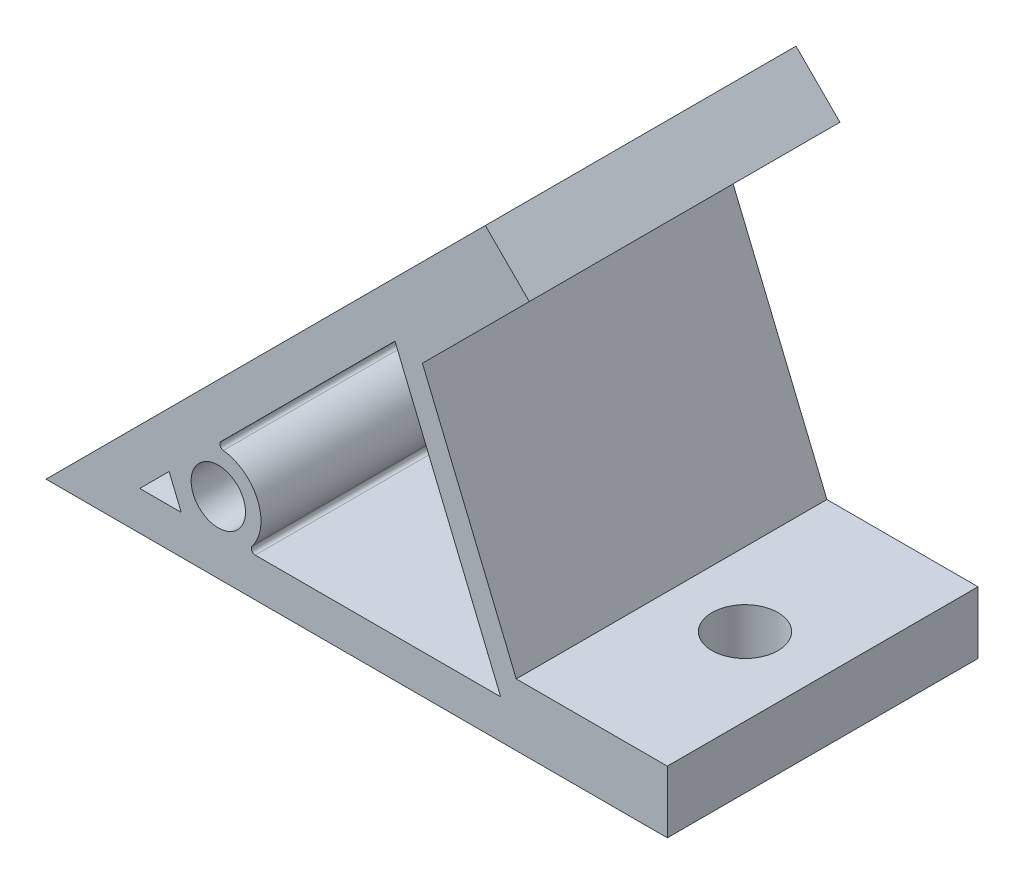
ISO-10303-21;
HEADER;
FILE_DESCRIPTION(('STEP AP214'),'2;1');
FILE_NAME('part.step','',(''),(''),'','','');
FILE_SCHEMA(('AUTOMOTIVE_DESIGN { 1 0 10303 214 1 1 1 1 }'));
ENDSEC;
DATA;
#1=APPLICATION_CONTEXT('core data for automotive mechanical design processes');
#2=APPLICATION_PROTOCOL_DEFINITION('international standard','automotive_design',2000,#1);
#3=PRODUCT_CONTEXT('',#1,'mechanical');
#4=PRODUCT('Part','Part','',(#3));
#5=PRODUCT_RELATED_PRODUCT_CATEGORY('part','',(#4));
#6=PRODUCT_DEFINITION_FORMATION('','',#4);
#7=PRODUCT_DEFINITION_CONTEXT('part definition',#1,'design');
#8=PRODUCT_DEFINITION('design','',#6,#7);
#9=PRODUCT_DEFINITION_SHAPE('','',#8);
#10=(LENGTH_UNIT() NAMED_UNIT(*) SI_UNIT(.MILLI.,.METRE.));
#11=(NAMED_UNIT(*) PLANE_ANGLE_UNIT() SI_UNIT($,.RADIAN.));
#12=(NAMED_UNIT(*) SI_UNIT($,.STERADIAN.) SOLID_ANGLE_UNIT());
#13=UNCERTAINTY_MEASURE_WITH_UNIT(LENGTH_MEASURE(1.E-05),#10,'distance_accuracy_value','');
#14=(GEOMETRIC_REPRESENTATION_CONTEXT(3) GLOBAL_UNCERTAINTY_ASSIGNED_CONTEXT((#13)) GLOBAL_UNIT_ASSIGNED_CONTEXT((#10,
#11,#12)) REPRESENTATION_CONTEXT('',''));
#15=CARTESIAN_POINT('',(0.,0.,0.));
#16=DIRECTION('',(0.,0.,1.));
#17=DIRECTION('',(1.,0.,0.));
#18=AXIS2_PLACEMENT_3D('',#15,#16,#17);
#19=CARTESIAN_POINT('',(80.,0.,20.));
#20=DIRECTION('',(0.,0.,1.));
#21=DIRECTION('',(1.,0.,0.));
#22=AXIS2_PLACEMENT_3D('',#19,#20,#21);
#23=PLANE('',#22);
#24=CARTESIAN_POINT('',(22.1846771867485,9.15647377294881,20.));
#25=DIRECTION('',(0.,0.,1.));
#26=DIRECTION('',(1.,0.,0.));
#27=AXIS2_PLACEMENT_3D('',#24,#25,#26);
#28=CIRCLE('',#27,3.5);
#29=CARTESIAN_POINT('',(25.6846771867485,9.15647377294881,20.));
#30=VERTEX_POINT('',#29);
#31=EDGE_CURVE('E198',#30,#30,#28,.T.);
#32=ORIENTED_EDGE('',*,*,#31,.F.);
#33=EDGE_LOOP('',(#32));
#34=FACE_BOUND('',#33,.T.);
#35=DIRECTION('',(1.,0.,0.));
#36=VECTOR('',#35,1.);
#37=CARTESIAN_POINT('',(0.,0.,20.));
#38=LINE('',#37,#36);
#39=CARTESIAN_POINT('',(0.,0.,20.));
#40=VERTEX_POINT('',#39);
#41=CARTESIAN_POINT('',(80.,0.,20.));
#42=VERTEX_POINT('',#41);
#43=EDGE_CURVE('E228',#40,#42,#38,.T.);
#44=ORIENTED_EDGE('',*,*,#43,.T.);
#45=DIRECTION('',(0.,1.,0.));
#46=VECTOR('',#45,1.);
#47=CARTESIAN_POINT('',(80.,0.,20.));
#48=LINE('',#47,#46);
#49=CARTESIAN_POINT('',(80.,8.,20.));
#50=VERTEX_POINT('',#49);
#51=EDGE_CURVE('E231',#42,#50,#48,.T.);
#52=ORIENTED_EDGE('',*,*,#51,.T.);
#53=DIRECTION('',(-1.,0.,0.));
#54=VECTOR('',#53,1.);
#55=CARTESIAN_POINT('',(60.5474313182664,8.,20.));
#56=LINE('',#55,#54);
#57=CARTESIAN_POINT('',(60.5474313182664,8.,20.));
#58=VERTEX_POINT('',#57);
#59=EDGE_CURVE('E234',#50,#58,#56,.T.);
#60=ORIENTED_EDGE('',*,*,#59,.T.);
#61=DIRECTION('',(-0.382683432365087,0.923879532511288,0.));
#62=VECTOR('',#61,1.);
#63=CARTESIAN_POINT('',(60.5474313182664,8.,20.));
#64=LINE('',#63,#62);
#65=CARTESIAN_POINT('',(48.4703535180654,37.1566450190806,20.));
#66=VERTEX_POINT('',#65);
#67=EDGE_CURVE('E236',#58,#66,#64,.T.);
#68=ORIENTED_EDGE('',*,*,#67,.T.);
#69=DIRECTION('',(0.707106781186547,0.707106781186548,0.));
#70=VECTOR('',#69,1.);
#71=CARTESIAN_POINT('',(48.4703535180654,37.1566450190806,20.));
#72=LINE('',#71,#70);
#73=CARTESIAN_POINT('',(62.2253967444162,50.9116882454314,20.));
#74=VERTEX_POINT('',#73);
#75=EDGE_CURVE('E238',#66,#74,#72,.T.);
#76=ORIENTED_EDGE('',*,*,#75,.T.);
#77=DIRECTION('',(-0.707106781186549,0.707106781186546,0.));
#78=VECTOR('',#77,1.);
#79=CARTESIAN_POINT('',(62.2253967444162,50.9116882454314,20.));
#80=LINE('',#79,#78);
#81=CARTESIAN_POINT('',(56.5685424949237,56.5685424949239,20.));
#82=VERTEX_POINT('',#81);
#83=EDGE_CURVE('E240',#74,#82,#80,.T.);
#84=ORIENTED_EDGE('',*,*,#83,.T.);
#85=DIRECTION('',(-0.707106781186546,-0.707106781186549,0.));
#86=VECTOR('',#85,1.);
#87=CARTESIAN_POINT('',(0.,0.,20.));
#88=LINE('',#87,#86);
#89=EDGE_CURVE('E242',#82,#40,#88,.T.);
#90=ORIENTED_EDGE('',*,*,#89,.T.);
#91=EDGE_LOOP('',(#44,#52,#60,#68,#76,#84,#90));
#92=FACE_BOUND('',#91,.T.);
#93=DIRECTION('',(-0.382683432365087,0.923879532511288,0.));
#94=VECTOR('',#93,1.);
#95=CARTESIAN_POINT('',(15.8476713770087,8.77660356514327,20.));
#96=LINE('',#95,#94);
#97=CARTESIAN_POINT('',(17.4119917933976,5.,20.));
#98=VERTEX_POINT('',#97);
#99=CARTESIAN_POINT('',(15.8476713770087,8.77660356514326,20.));
#100=VERTEX_POINT('',#99);
#101=EDGE_CURVE('E206',#98,#100,#96,.T.);
#102=ORIENTED_EDGE('',*,*,#101,.F.);
#103=DIRECTION('',(1.,0.,0.));
#104=VECTOR('',#103,1.);
#105=CARTESIAN_POINT('',(12.0710678118655,5.,20.));
#106=LINE('',#105,#104);
#107=CARTESIAN_POINT('',(12.0710678118655,5.,20.));
#108=VERTEX_POINT('',#107);
#109=EDGE_CURVE('E204',#108,#98,#106,.T.);
#110=ORIENTED_EDGE('',*,*,#109,.F.);
#111=DIRECTION('',(-0.707106781186543,-0.707106781186552,0.));
#112=VECTOR('',#111,1.);
#113=CARTESIAN_POINT('',(12.0710678118655,5.,20.));
#114=LINE('',#113,#112);
#115=EDGE_CURVE('E210',#100,#108,#114,.T.);
#116=ORIENTED_EDGE('',*,*,#115,.F.);
#117=EDGE_LOOP('',(#102,#110,#116));
#118=FACE_BOUND('',#117,.T.);
#119=DIRECTION('',(1.,0.,0.));
#120=VECTOR('',#119,1.);
#121=CARTESIAN_POINT('',(26.9417981172838,5.,20.));
#122=LINE('',#121,#120);
#123=CARTESIAN_POINT('',(26.9417981172838,5.,20.));
#124=VERTEX_POINT('',#123);
#125=CARTESIAN_POINT('',(58.5428954045085,5.,20.));
#126=VERTEX_POINT('',#125);
#127=EDGE_CURVE('E153',#124,#126,#122,.T.);
#128=ORIENTED_EDGE('',*,*,#127,.F.);
#129=CARTESIAN_POINT('',(26.9417981172838,5.5,20.));
#130=DIRECTION('',(0.,0.,1.));
#131=DIRECTION('',(-1.,0.,0.));
#132=AXIS2_PLACEMENT_3D('',#129,#130,#131);
#133=CIRCLE('',#132,0.5);
#134=CARTESIAN_POINT('',(26.5453713730726,5.80470614774571,20.));
#135=VERTEX_POINT('',#134);
#136=EDGE_CURVE('E145',#135,#124,#133,.T.);
#137=ORIENTED_EDGE('',*,*,#136,.F.);
#138=CARTESIAN_POINT('',(22.1846771867485,9.15647377294881,20.));
#139=DIRECTION('',(0.,0.,-1.));
#140=DIRECTION('',(1.,0.,0.));
#141=AXIS2_PLACEMENT_3D('',#138,#139,#140);
#142=CIRCLE('',#141,5.5);
#143=CARTESIAN_POINT('',(22.8337204048437,14.6180434100627,20.));
#144=VERTEX_POINT('',#143);
#145=EDGE_CURVE('E175',#144,#135,#142,.T.);
#146=ORIENTED_EDGE('',*,*,#145,.F.);
#147=CARTESIAN_POINT('',(22.8927243337614,15.1145497407095,20.));
#148=DIRECTION('',(0.,0.,1.));
#149=DIRECTION('',(1.,0.,0.));
#150=AXIS2_PLACEMENT_3D('',#147,#148,#149);
#151=CIRCLE('',#150,0.500000000000001);
#152=CARTESIAN_POINT('',(22.5391709431682,15.4681031313028,20.));
#153=VERTEX_POINT('',#152);
#154=EDGE_CURVE('E173',#153,#144,#151,.T.);
#155=ORIENTED_EDGE('',*,*,#154,.F.);
#156=DIRECTION('',(-0.707106781186546,-0.707106781186549,0.));
#157=VECTOR('',#156,1.);
#158=CARTESIAN_POINT('',(22.5391709431682,15.4681031313028,20.));
#159=LINE('',#158,#157);
#160=CARTESIAN_POINT('',(44.9316122367555,37.8605444248902,20.));
#161=VERTEX_POINT('',#160);
#162=EDGE_CURVE('E168',#161,#153,#159,.T.);
#163=ORIENTED_EDGE('',*,*,#162,.F.);
#164=DIRECTION('',(-0.382683432365087,0.923879532511288,0.));
#165=VECTOR('',#164,1.);
#166=CARTESIAN_POINT('',(58.5428954045085,5.,20.));
#167=LINE('',#166,#165);
#168=EDGE_CURVE('E166',#126,#161,#167,.T.);
#169=ORIENTED_EDGE('',*,*,#168,.F.);
#170=EDGE_LOOP('',(#128,#137,#146,#155,#163,#169));
#171=FACE_BOUND('',#170,.T.);
#172=ADVANCED_FACE('F31',(#34,#92,#118,#171),#23,.T.);
#173=CARTESIAN_POINT('',(80.,0.,-20.));
#174=DIRECTION('',(0.,0.,1.));
#175=DIRECTION('',(1.,0.,0.));
#176=AXIS2_PLACEMENT_3D('',#173,#174,#175);
#177=PLANE('',#176);
#178=CARTESIAN_POINT('',(22.1846771867485,9.15647377294881,-20.));
#179=DIRECTION('',(0.,0.,1.));
#180=DIRECTION('',(1.,0.,0.));
#181=AXIS2_PLACEMENT_3D('',#178,#179,#180);
#182=CIRCLE('',#181,3.5);
#183=CARTESIAN_POINT('',(25.6846771867485,9.15647377294881,-20.));
#184=VERTEX_POINT('',#183);
#185=EDGE_CURVE('E161',#184,#184,#182,.T.);
#186=ORIENTED_EDGE('',*,*,#185,.T.);
#187=EDGE_LOOP('',(#186));
#188=FACE_BOUND('',#187,.T.);
#189=DIRECTION('',(1.,0.,0.));
#190=VECTOR('',#189,1.);
#191=CARTESIAN_POINT('',(0.,0.,-20.));
#192=LINE('',#191,#190);
#193=CARTESIAN_POINT('',(0.,0.,-20.));
#194=VERTEX_POINT('',#193);
#195=CARTESIAN_POINT('',(80.,0.,-20.));
#196=VERTEX_POINT('',#195);
#197=EDGE_CURVE('E227',#194,#196,#192,.T.);
#198=ORIENTED_EDGE('',*,*,#197,.F.);
#199=DIRECTION('',(-0.707106781186546,-0.707106781186549,0.));
#200=VECTOR('',#199,1.);
#201=CARTESIAN_POINT('',(0.,0.,-20.));
#202=LINE('',#201,#200);
#203=CARTESIAN_POINT('',(56.5685424949237,56.5685424949239,-20.));
#204=VERTEX_POINT('',#203);
#205=EDGE_CURVE('E232',#204,#194,#202,.T.);
#206=ORIENTED_EDGE('',*,*,#205,.F.);
#207=DIRECTION('',(-0.707106781186549,0.707106781186546,0.));
#208=VECTOR('',#207,1.);
#209=CARTESIAN_POINT('',(62.2253967444162,50.9116882454314,-20.));
#210=LINE('',#209,#208);
#211=CARTESIAN_POINT('',(62.2253967444162,50.9116882454314,-20.));
#212=VERTEX_POINT('',#211);
#213=EDGE_CURVE('E255',#212,#204,#210,.T.);
#214=ORIENTED_EDGE('',*,*,#213,.F.);
#215=DIRECTION('',(0.707106781186547,0.707106781186548,0.));
#216=VECTOR('',#215,1.);
#217=CARTESIAN_POINT('',(48.4703535180654,37.1566450190806,-20.));
#218=LINE('',#217,#216);
#219=CARTESIAN_POINT('',(48.4703535180654,37.1566450190806,-20.));
#220=VERTEX_POINT('',#219);
#221=EDGE_CURVE('E253',#220,#212,#218,.T.);
#222=ORIENTED_EDGE('',*,*,#221,.F.);
#223=DIRECTION('',(-0.382683432365087,0.923879532511288,0.));
#224=VECTOR('',#223,1.);
#225=CARTESIAN_POINT('',(60.5474313182664,8.,-20.));
#226=LINE('',#225,#224);
#227=CARTESIAN_POINT('',(60.5474313182664,8.,-20.));
#228=VERTEX_POINT('',#227);
#229=EDGE_CURVE('E251',#228,#220,#226,.T.);
#230=ORIENTED_EDGE('',*,*,#229,.F.);
#231=DIRECTION('',(-1.,0.,0.));
#232=VECTOR('',#231,1.);
#233=CARTESIAN_POINT('',(60.5474313182664,8.,-20.));
#234=LINE('',#233,#232);
#235=CARTESIAN_POINT('',(80.,8.,-20.));
#236=VERTEX_POINT('',#235);
#237=EDGE_CURVE('E249',#236,#228,#234,.T.);
#238=ORIENTED_EDGE('',*,*,#237,.F.);
#239=DIRECTION('',(0.,1.,0.));
#240=VECTOR('',#239,1.);
#241=CARTESIAN_POINT('',(80.,0.,-20.));
#242=LINE('',#241,#240);
#243=EDGE_CURVE('E247',#196,#236,#242,.T.);
#244=ORIENTED_EDGE('',*,*,#243,.F.);
#245=EDGE_LOOP('',(#198,#206,#214,#222,#230,#238,#244));
#246=FACE_BOUND('',#245,.T.);
#247=DIRECTION('',(1.,0.,0.));
#248=VECTOR('',#247,1.);
#249=CARTESIAN_POINT('',(12.0710678118655,5.,-20.));
#250=LINE('',#249,#248);
#251=CARTESIAN_POINT('',(12.0710678118655,5.,-20.));
#252=VERTEX_POINT('',#251);
#253=CARTESIAN_POINT('',(17.4119917933976,5.,-20.));
#254=VERTEX_POINT('',#253);
#255=EDGE_CURVE('E201',#252,#254,#250,.T.);
#256=ORIENTED_EDGE('',*,*,#255,.T.);
#257=DIRECTION('',(-0.382683432365087,0.923879532511288,0.));
#258=VECTOR('',#257,1.);
#259=CARTESIAN_POINT('',(15.8476713770087,8.77660356514327,-20.));
#260=LINE('',#259,#258);
#261=CARTESIAN_POINT('',(15.8476713770087,8.77660356514327,-20.));
#262=VERTEX_POINT('',#261);
#263=EDGE_CURVE('E215',#254,#262,#260,.T.);
#264=ORIENTED_EDGE('',*,*,#263,.T.);
#265=DIRECTION('',(-0.707106781186543,-0.707106781186552,0.));
#266=VECTOR('',#265,1.);
#267=CARTESIAN_POINT('',(12.0710678118655,5.,-20.));
#268=LINE('',#267,#266);
#269=EDGE_CURVE('E207',#262,#252,#268,.T.);
#270=ORIENTED_EDGE('',*,*,#269,.T.);
#271=EDGE_LOOP('',(#256,#264,#270));
#272=FACE_BOUND('',#271,.T.);
#273=CARTESIAN_POINT('',(26.9417981172838,5.5,-20.));
#274=DIRECTION('',(0.,0.,1.));
#275=DIRECTION('',(-1.,0.,0.));
#276=AXIS2_PLACEMENT_3D('',#273,#274,#275);
#277=CIRCLE('',#276,0.5);
#278=CARTESIAN_POINT('',(26.5453713730726,5.8047061477457,-20.));
#279=VERTEX_POINT('',#278);
#280=CARTESIAN_POINT('',(26.9417981172838,5.,-20.));
#281=VERTEX_POINT('',#280);
#282=EDGE_CURVE('E55',#279,#281,#277,.T.);
#283=ORIENTED_EDGE('',*,*,#282,.T.);
#284=DIRECTION('',(1.,0.,0.));
#285=VECTOR('',#284,1.);
#286=CARTESIAN_POINT('',(26.9417981172838,5.,-20.));
#287=LINE('',#286,#285);
#288=CARTESIAN_POINT('',(58.5428954045085,5.,-20.));
#289=VERTEX_POINT('',#288);
#290=EDGE_CURVE('E160',#281,#289,#287,.T.);
#291=ORIENTED_EDGE('',*,*,#290,.T.);
#292=DIRECTION('',(-0.382683432365087,0.923879532511288,0.));
#293=VECTOR('',#292,1.);
#294=CARTESIAN_POINT('',(58.5428954045085,5.,-20.));
#295=LINE('',#294,#293);
#296=CARTESIAN_POINT('',(44.9316122367555,37.8605444248902,-20.));
#297=VERTEX_POINT('',#296);
#298=EDGE_CURVE('E180',#289,#297,#295,.T.);
#299=ORIENTED_EDGE('',*,*,#298,.T.);
#300=DIRECTION('',(-0.707106781186546,-0.707106781186549,0.));
#301=VECTOR('',#300,1.);
#302=CARTESIAN_POINT('',(22.5391709431682,15.4681031313028,-20.));
#303=LINE('',#302,#301);
#304=CARTESIAN_POINT('',(22.5391709431682,15.4681031313028,-20.));
#305=VERTEX_POINT('',#304);
#306=EDGE_CURVE('E183',#297,#305,#303,.T.);
#307=ORIENTED_EDGE('',*,*,#306,.T.);
#308=CARTESIAN_POINT('',(22.8927243337614,15.1145497407095,-20.));
#309=DIRECTION('',(0.,0.,1.));
#310=DIRECTION('',(1.,0.,0.));
#311=AXIS2_PLACEMENT_3D('',#308,#309,#310);
#312=CIRCLE('',#311,0.500000000000001);
#313=CARTESIAN_POINT('',(22.8337204048437,14.6180434100628,-20.));
#314=VERTEX_POINT('',#313);
#315=EDGE_CURVE('E186',#305,#314,#312,.T.);
#316=ORIENTED_EDGE('',*,*,#315,.T.);
#317=CARTESIAN_POINT('',(22.1846771867485,9.15647377294881,-20.));
#318=DIRECTION('',(0.,0.,-1.));
#319=DIRECTION('',(1.,0.,0.));
#320=AXIS2_PLACEMENT_3D('',#317,#318,#319);
#321=CIRCLE('',#320,5.5);
#322=EDGE_CURVE('E154',#314,#279,#321,.T.);
#323=ORIENTED_EDGE('',*,*,#322,.T.);
#324=EDGE_LOOP('',(#283,#291,#299,#307,#316,#323));
#325=FACE_BOUND('',#324,.T.);
#326=ADVANCED_FACE('F283',(#188,#246,#272,#325),#177,.F.);
#327=CARTESIAN_POINT('',(0.,0.,20.));
#328=DIRECTION('',(0.,1.,0.));
#329=DIRECTION('',(0.,0.,1.));
#330=AXIS2_PLACEMENT_3D('',#327,#328,#329);
#331=PLANE('',#330);
#332=CARTESIAN_POINT('',(70.,0.,0.));
#333=DIRECTION('',(0.,-1.,0.));
#334=DIRECTION('',(0.,0.,-1.));
#335=AXIS2_PLACEMENT_3D('',#332,#333,#334);
#336=CIRCLE('',#335,4.25000000000001);
#337=CARTESIAN_POINT('',(70.,0.,-4.25000000000001));
#338=VERTEX_POINT('',#337);
#339=EDGE_CURVE('E377',#338,#338,#336,.T.);
#340=ORIENTED_EDGE('',*,*,#339,.F.);
#341=EDGE_LOOP('',(#340));
#342=FACE_BOUND('',#341,.T.);
#343=ORIENTED_EDGE('',*,*,#197,.T.);
#344=DIRECTION('',(0.,0.,-1.));
#345=VECTOR('',#344,1.);
#346=CARTESIAN_POINT('',(80.,0.,20.));
#347=LINE('',#346,#345);
#348=EDGE_CURVE('E11',#42,#196,#347,.T.);
#349=ORIENTED_EDGE('',*,*,#348,.F.);
#350=ORIENTED_EDGE('',*,*,#43,.F.);
#351=DIRECTION('',(0.,0.,-1.));
#352=VECTOR('',#351,1.);
#353=CARTESIAN_POINT('',(0.,0.,20.));
#354=LINE('',#353,#352);
#355=EDGE_CURVE('E244',#40,#194,#354,.T.);
#356=ORIENTED_EDGE('',*,*,#355,.T.);
#357=EDGE_LOOP('',(#343,#349,#350,#356));
#358=FACE_BOUND('',#357,.T.);
#359=ADVANCED_FACE('F33',(#342,#358),#331,.F.);
#360=CARTESIAN_POINT('',(80.,0.,20.));
#361=DIRECTION('',(-1.,0.,0.));
#362=DIRECTION('',(0.,0.,1.));
#363=AXIS2_PLACEMENT_3D('',#360,#361,#362);
#364=PLANE('',#363);
#365=ORIENTED_EDGE('',*,*,#243,.T.);
#366=DIRECTION('',(0.,0.,-1.));
#367=VECTOR('',#366,1.);
#368=CARTESIAN_POINT('',(80.,8.,20.));
#369=LINE('',#368,#367);
#370=EDGE_CURVE('E40',#50,#236,#369,.T.);
#371=ORIENTED_EDGE('',*,*,#370,.F.);
#372=ORIENTED_EDGE('',*,*,#51,.F.);
#373=ORIENTED_EDGE('',*,*,#348,.T.);
#374=EDGE_LOOP('',(#365,#371,#372,#373));
#375=FACE_BOUND('',#374,.T.);
#376=ADVANCED_FACE('F301',(#375),#364,.F.);
#377=CARTESIAN_POINT('',(60.5474313182664,8.,20.));
#378=DIRECTION('',(0.,-1.,0.));
#379=DIRECTION('',(0.,0.,-1.));
#380=AXIS2_PLACEMENT_3D('',#377,#378,#379);
#381=PLANE('',#380);
#382=CARTESIAN_POINT('',(70.,8.,0.));
#383=DIRECTION('',(0.,-1.,0.));
#384=DIRECTION('',(0.,0.,-1.));
#385=AXIS2_PLACEMENT_3D('',#382,#383,#384);
#386=CIRCLE('',#385,4.25000000000001);
#387=CARTESIAN_POINT('',(70.,8.,-4.25000000000001));
#388=VERTEX_POINT('',#387);
#389=EDGE_CURVE('E35',#388,#388,#386,.T.);
#390=ORIENTED_EDGE('',*,*,#389,.T.);
#391=EDGE_LOOP('',(#390));
#392=FACE_BOUND('',#391,.T.);
#393=ORIENTED_EDGE('',*,*,#237,.T.);
#394=DIRECTION('',(0.,0.,-1.));
#395=VECTOR('',#394,1.);
#396=CARTESIAN_POINT('',(60.5474313182664,8.,20.));
#397=LINE('',#396,#395);
#398=EDGE_CURVE('E269',#58,#228,#397,.T.);
#399=ORIENTED_EDGE('',*,*,#398,.F.);
#400=ORIENTED_EDGE('',*,*,#59,.F.);
#401=ORIENTED_EDGE('',*,*,#370,.T.);
#402=EDGE_LOOP('',(#393,#399,#400,#401));
#403=FACE_BOUND('',#402,.T.);
#404=ADVANCED_FACE('F277',(#392,#403),#381,.F.);
#405=CARTESIAN_POINT('',(60.5474313182664,8.,20.));
#406=DIRECTION('',(-0.923879532511288,-0.382683432365087,0.));
#407=DIRECTION('',(0.382683432365087,-0.923879532511288,0.));
#408=AXIS2_PLACEMENT_3D('',#405,#406,#407);
#409=PLANE('',#408);
#410=ORIENTED_EDGE('',*,*,#229,.T.);
#411=DIRECTION('',(0.,0.,-1.));
#412=VECTOR('',#411,1.);
#413=CARTESIAN_POINT('',(48.4703535180654,37.1566450190806,20.));
#414=LINE('',#413,#412);
#415=EDGE_CURVE('E266',#66,#220,#414,.T.);
#416=ORIENTED_EDGE('',*,*,#415,.F.);
#417=ORIENTED_EDGE('',*,*,#67,.F.);
#418=ORIENTED_EDGE('',*,*,#398,.T.);
#419=EDGE_LOOP('',(#410,#416,#417,#418));
#420=FACE_BOUND('',#419,.T.);
#421=ADVANCED_FACE('F289',(#420),#409,.F.);
#422=CARTESIAN_POINT('',(48.4703535180654,37.1566450190806,20.));
#423=DIRECTION('',(-0.707106781186548,0.707106781186547,0.));
#424=DIRECTION('',(-0.707106781186547,-0.707106781186548,0.));
#425=AXIS2_PLACEMENT_3D('',#422,#423,#424);
#426=PLANE('',#425);
#427=CARTESIAN_POINT('',(55.1543289325507,43.840620433566,0.));
#428=DIRECTION('',(-0.707106781186548,0.707106781186547,0.));
#429=DIRECTION('',(-0.707106781186547,-0.707106781186548,0.));
#430=AXIS2_PLACEMENT_3D('',#427,#428,#429);
#431=CIRCLE('',#430,4.25);
#432=CARTESIAN_POINT('',(52.1491251125079,40.8354166135231,0.));
#433=VERTEX_POINT('',#432);
#434=EDGE_CURVE('E178',#433,#433,#431,.T.);
#435=ORIENTED_EDGE('',*,*,#434,.T.);
#436=EDGE_LOOP('',(#435));
#437=FACE_BOUND('',#436,.T.);
#438=ORIENTED_EDGE('',*,*,#221,.T.);
#439=DIRECTION('',(0.,0.,-1.));
#440=VECTOR('',#439,1.);
#441=CARTESIAN_POINT('',(62.2253967444162,50.9116882454314,20.));
#442=LINE('',#441,#440);
#443=EDGE_CURVE('E263',#74,#212,#442,.T.);
#444=ORIENTED_EDGE('',*,*,#443,.F.);
#445=ORIENTED_EDGE('',*,*,#75,.F.);
#446=ORIENTED_EDGE('',*,*,#415,.T.);
#447=EDGE_LOOP('',(#438,#444,#445,#446));
#448=FACE_BOUND('',#447,.T.);
#449=ADVANCED_FACE('F293',(#437,#448),#426,.F.);
#450=CARTESIAN_POINT('',(62.2253967444162,50.9116882454314,20.));
#451=DIRECTION('',(-0.707106781186546,-0.707106781186549,0.));
#452=DIRECTION('',(0.707106781186549,-0.707106781186546,0.));
#453=AXIS2_PLACEMENT_3D('',#450,#451,#452);
#454=PLANE('',#453);
#455=ORIENTED_EDGE('',*,*,#213,.T.);
#456=DIRECTION('',(0.,0.,-1.));
#457=VECTOR('',#456,1.);
#458=CARTESIAN_POINT('',(56.5685424949237,56.5685424949239,20.));
#459=LINE('',#458,#457);
#460=EDGE_CURVE('E260',#82,#204,#459,.T.);
#461=ORIENTED_EDGE('',*,*,#460,.F.);
#462=ORIENTED_EDGE('',*,*,#83,.F.);
#463=ORIENTED_EDGE('',*,*,#443,.T.);
#464=EDGE_LOOP('',(#455,#461,#462,#463));
#465=FACE_BOUND('',#464,.T.);
#466=ADVANCED_FACE('F309',(#465),#454,.F.);
#467=CARTESIAN_POINT('',(0.,0.,20.));
#468=DIRECTION('',(0.707106781186549,-0.707106781186546,0.));
#469=DIRECTION('',(0.707106781186546,0.707106781186549,0.));
#470=AXIS2_PLACEMENT_3D('',#467,#468,#469);
#471=PLANE('',#470);
#472=CARTESIAN_POINT('',(49.4974746830583,49.4974746830584,0.));
#473=DIRECTION('',(-0.707106781186549,0.707106781186546,0.));
#474=DIRECTION('',(-0.707106781186546,-0.707106781186549,0.));
#475=AXIS2_PLACEMENT_3D('',#472,#473,#474);
#476=CIRCLE('',#475,4.25);
#477=CARTESIAN_POINT('',(46.4922708630154,46.4922708630156,0.));
#478=VERTEX_POINT('',#477);
#479=EDGE_CURVE('E381',#478,#478,#476,.T.);
#480=ORIENTED_EDGE('',*,*,#479,.F.);
#481=EDGE_LOOP('',(#480));
#482=FACE_BOUND('',#481,.T.);
#483=ORIENTED_EDGE('',*,*,#205,.T.);
#484=ORIENTED_EDGE('',*,*,#355,.F.);
#485=ORIENTED_EDGE('',*,*,#89,.F.);
#486=ORIENTED_EDGE('',*,*,#460,.T.);
#487=EDGE_LOOP('',(#483,#484,#485,#486));
#488=FACE_BOUND('',#487,.T.);
#489=ADVANCED_FACE('F306',(#482,#488),#471,.F.);
#490=CARTESIAN_POINT('',(12.0710678118655,5.,20.));
#491=DIRECTION('',(0.,1.,0.));
#492=DIRECTION('',(0.,0.,1.));
#493=AXIS2_PLACEMENT_3D('',#490,#491,#492);
#494=PLANE('',#493);
#495=ORIENTED_EDGE('',*,*,#255,.F.);
#496=DIRECTION('',(0.,0.,-1.));
#497=VECTOR('',#496,1.);
#498=CARTESIAN_POINT('',(12.0710678118655,5.,20.));
#499=LINE('',#498,#497);
#500=EDGE_CURVE('E212',#108,#252,#499,.T.);
#501=ORIENTED_EDGE('',*,*,#500,.F.);
#502=ORIENTED_EDGE('',*,*,#109,.T.);
#503=DIRECTION('',(0.,0.,-1.));
#504=VECTOR('',#503,1.);
#505=CARTESIAN_POINT('',(17.4119917933976,5.,20.));
#506=LINE('',#505,#504);
#507=EDGE_CURVE('E224',#98,#254,#506,.T.);
#508=ORIENTED_EDGE('',*,*,#507,.T.);
#509=EDGE_LOOP('',(#495,#501,#502,#508));
#510=FACE_BOUND('',#509,.T.);
#511=ADVANCED_FACE('F316',(#510),#494,.T.);
#512=CARTESIAN_POINT('',(15.8476713770087,8.77660356514327,20.));
#513=DIRECTION('',(-0.923879532511288,-0.382683432365087,0.));
#514=DIRECTION('',(0.382683432365087,-0.923879532511288,0.));
#515=AXIS2_PLACEMENT_3D('',#512,#513,#514);
#516=PLANE('',#515);
#517=ORIENTED_EDGE('',*,*,#263,.F.);
#518=ORIENTED_EDGE('',*,*,#507,.F.);
#519=ORIENTED_EDGE('',*,*,#101,.T.);
#520=DIRECTION('',(0.,0.,-1.));
#521=VECTOR('',#520,1.);
#522=CARTESIAN_POINT('',(15.8476713770087,8.77660356514327,20.));
#523=LINE('',#522,#521);
#524=EDGE_CURVE('E222',#100,#262,#523,.T.);
#525=ORIENTED_EDGE('',*,*,#524,.T.);
#526=EDGE_LOOP('',(#517,#518,#519,#525));
#527=FACE_BOUND('',#526,.T.);
#528=ADVANCED_FACE('F333',(#527),#516,.T.);
#529=CARTESIAN_POINT('',(12.0710678118655,5.,20.));
#530=DIRECTION('',(0.707106781186552,-0.707106781186543,0.));
#531=DIRECTION('',(0.707106781186543,0.707106781186552,0.));
#532=AXIS2_PLACEMENT_3D('',#529,#530,#531);
#533=PLANE('',#532);
#534=ORIENTED_EDGE('',*,*,#269,.F.);
#535=ORIENTED_EDGE('',*,*,#524,.F.);
#536=ORIENTED_EDGE('',*,*,#115,.T.);
#537=ORIENTED_EDGE('',*,*,#500,.T.);
#538=EDGE_LOOP('',(#534,#535,#536,#537));
#539=FACE_BOUND('',#538,.T.);
#540=ADVANCED_FACE('F337',(#539),#533,.T.);
#541=CARTESIAN_POINT('',(22.1846771867485,9.15647377294881,20.));
#542=DIRECTION('',(0.,0.,-1.));
#543=DIRECTION('',(-1.,0.,0.));
#544=AXIS2_PLACEMENT_3D('',#541,#542,#543);
#545=CYLINDRICAL_SURFACE('',#544,3.5);
#546=ORIENTED_EDGE('',*,*,#31,.T.);
#547=EDGE_LOOP('',(#546));
#548=FACE_BOUND('',#547,.T.);
#549=ORIENTED_EDGE('',*,*,#185,.F.);
#550=EDGE_LOOP('',(#549));
#551=FACE_BOUND('',#550,.T.);
#552=ADVANCED_FACE('F341',(#548,#551),#545,.F.);
#553=CARTESIAN_POINT('',(26.9417981172838,5.5,20.));
#554=DIRECTION('',(0.,0.,-1.));
#555=DIRECTION('',(-1.,0.,0.));
#556=AXIS2_PLACEMENT_3D('',#553,#554,#555);
#557=CYLINDRICAL_SURFACE('',#556,0.5);
#558=ORIENTED_EDGE('',*,*,#282,.F.);
#559=DIRECTION('',(0.,0.,-1.));
#560=VECTOR('',#559,1.);
#561=CARTESIAN_POINT('',(26.5453713730726,5.80470614774571,20.));
#562=LINE('',#561,#560);
#563=EDGE_CURVE('E149',#135,#279,#562,.T.);
#564=ORIENTED_EDGE('',*,*,#563,.F.);
#565=ORIENTED_EDGE('',*,*,#136,.T.);
#566=DIRECTION('',(0.,0.,-1.));
#567=VECTOR('',#566,1.);
#568=CARTESIAN_POINT('',(26.9417981172838,5.,20.));
#569=LINE('',#568,#567);
#570=EDGE_CURVE('E148',#124,#281,#569,.T.);
#571=ORIENTED_EDGE('',*,*,#570,.T.);
#572=EDGE_LOOP('',(#558,#564,#565,#571));
#573=FACE_BOUND('',#572,.T.);
#574=ADVANCED_FACE('F147',(#573),#557,.F.);
#575=CARTESIAN_POINT('',(26.9417981172838,5.,20.));
#576=DIRECTION('',(0.,1.,0.));
#577=DIRECTION('',(-1.,0.,0.));
#578=AXIS2_PLACEMENT_3D('',#575,#576,#577);
#579=PLANE('',#578);
#580=ORIENTED_EDGE('',*,*,#290,.F.);
#581=ORIENTED_EDGE('',*,*,#570,.F.);
#582=ORIENTED_EDGE('',*,*,#127,.T.);
#583=DIRECTION('',(0.,0.,-1.));
#584=VECTOR('',#583,1.);
#585=CARTESIAN_POINT('',(58.5428954045085,5.,20.));
#586=LINE('',#585,#584);
#587=EDGE_CURVE('E162',#126,#289,#586,.T.);
#588=ORIENTED_EDGE('',*,*,#587,.T.);
#589=EDGE_LOOP('',(#580,#581,#582,#588));
#590=FACE_BOUND('',#589,.T.);
#591=ADVANCED_FACE('F157',(#590),#579,.T.);
#592=CARTESIAN_POINT('',(58.5428954045085,5.,20.));
#593=DIRECTION('',(-0.923879532511288,-0.382683432365087,0.));
#594=DIRECTION('',(0.382683432365087,-0.923879532511288,0.));
#595=AXIS2_PLACEMENT_3D('',#592,#593,#594);
#596=PLANE('',#595);
#597=ORIENTED_EDGE('',*,*,#298,.F.);
#598=ORIENTED_EDGE('',*,*,#587,.F.);
#599=ORIENTED_EDGE('',*,*,#168,.T.);
#600=DIRECTION('',(0.,0.,-1.));
#601=VECTOR('',#600,1.);
#602=CARTESIAN_POINT('',(44.9316122367555,37.8605444248902,20.));
#603=LINE('',#602,#601);
#604=EDGE_CURVE('E195',#161,#297,#603,.T.);
#605=ORIENTED_EDGE('',*,*,#604,.T.);
#606=EDGE_LOOP('',(#597,#598,#599,#605));
#607=FACE_BOUND('',#606,.T.);
#608=ADVANCED_FACE('F350',(#607),#596,.T.);
#609=CARTESIAN_POINT('',(22.5391709431682,15.4681031313028,20.));
#610=DIRECTION('',(0.707106781186549,-0.707106781186546,0.));
#611=DIRECTION('',(0.707106781186546,0.707106781186549,0.));
#612=AXIS2_PLACEMENT_3D('',#609,#610,#611);
#613=PLANE('',#612);
#614=ORIENTED_EDGE('',*,*,#306,.F.);
#615=ORIENTED_EDGE('',*,*,#604,.F.);
#616=ORIENTED_EDGE('',*,*,#162,.T.);
#617=DIRECTION('',(0.,0.,-1.));
#618=VECTOR('',#617,1.);
#619=CARTESIAN_POINT('',(22.5391709431682,15.4681031313028,20.));
#620=LINE('',#619,#618);
#621=EDGE_CURVE('E193',#153,#305,#620,.T.);
#622=ORIENTED_EDGE('',*,*,#621,.T.);
#623=EDGE_LOOP('',(#614,#615,#616,#622));
#624=FACE_BOUND('',#623,.T.);
#625=ADVANCED_FACE('F353',(#624),#613,.T.);
#626=CARTESIAN_POINT('',(22.8927243337614,15.1145497407095,20.));
#627=DIRECTION('',(0.,0.,-1.));
#628=DIRECTION('',(-1.,0.,0.));
#629=AXIS2_PLACEMENT_3D('',#626,#627,#628);
#630=CYLINDRICAL_SURFACE('',#629,0.500000000000001);
#631=ORIENTED_EDGE('',*,*,#315,.F.);
#632=ORIENTED_EDGE('',*,*,#621,.F.);
#633=ORIENTED_EDGE('',*,*,#154,.T.);
#634=DIRECTION('',(0.,0.,-1.));
#635=VECTOR('',#634,1.);
#636=CARTESIAN_POINT('',(22.8337204048437,14.6180434100628,20.));
#637=LINE('',#636,#635);
#638=EDGE_CURVE('E47',#144,#314,#637,.T.);
#639=ORIENTED_EDGE('',*,*,#638,.T.);
#640=EDGE_LOOP('',(#631,#632,#633,#639));
#641=FACE_BOUND('',#640,.T.);
#642=ADVANCED_FACE('F357',(#641),#630,.F.);
#643=CARTESIAN_POINT('',(22.1846771867485,9.15647377294881,20.));
#644=DIRECTION('',(0.,0.,-1.));
#645=DIRECTION('',(-1.,0.,0.));
#646=AXIS2_PLACEMENT_3D('',#643,#644,#645);
#647=CYLINDRICAL_SURFACE('',#646,5.5);
#648=ORIENTED_EDGE('',*,*,#322,.F.);
#649=ORIENTED_EDGE('',*,*,#638,.F.);
#650=ORIENTED_EDGE('',*,*,#145,.T.);
#651=ORIENTED_EDGE('',*,*,#563,.T.);
#652=EDGE_LOOP('',(#648,#649,#650,#651));
#653=FACE_BOUND('',#652,.T.);
#654=ADVANCED_FACE('F361',(#653),#647,.T.);
#655=CARTESIAN_POINT('',(63.6396103067892,35.3553390593275,0.));
#656=DIRECTION('',(-0.707106781186549,0.707106781186546,0.));
#657=DIRECTION('',(-0.707106781186546,-0.707106781186549,0.));
#658=AXIS2_PLACEMENT_3D('',#655,#656,#657);
#659=CYLINDRICAL_SURFACE('',#658,4.25);
#660=ORIENTED_EDGE('',*,*,#479,.T.);
#661=EDGE_LOOP('',(#660));
#662=FACE_BOUND('',#661,.T.);
#663=ORIENTED_EDGE('',*,*,#434,.F.);
#664=EDGE_LOOP('',(#663));
#665=FACE_BOUND('',#664,.T.);
#666=ADVANCED_FACE('F365',(#662,#665),#659,.F.);
#667=CARTESIAN_POINT('',(70.,20.,0.));
#668=DIRECTION('',(0.,-1.,0.));
#669=DIRECTION('',(0.,0.,-1.));
#670=AXIS2_PLACEMENT_3D('',#667,#668,#669);
#671=CYLINDRICAL_SURFACE('',#670,4.25000000000001);
#672=ORIENTED_EDGE('',*,*,#339,.T.);
#673=EDGE_LOOP('',(#672));
#674=FACE_BOUND('',#673,.T.);
#675=ORIENTED_EDGE('',*,*,#389,.F.);
#676=EDGE_LOOP('',(#675));
#677=FACE_BOUND('',#676,.T.);
#678=ADVANCED_FACE('F368',(#674,#677),#671,.F.);
#679=CLOSED_SHELL('',(#172,#326,#359,#376,#404,#421,#449,#466,#489,#511,#528,#540,#552,#574,
#591,#608,#625,#642,#654,#666,#678));
#680=MANIFOLD_SOLID_BREP('B2',#679);
#681=ADVANCED_BREP_SHAPE_REPRESENTATION('',(#18,#680),#14);
#682=SHAPE_DEFINITION_REPRESENTATION(#9,#681);
ENDSEC;
END-ISO-10303-21;
